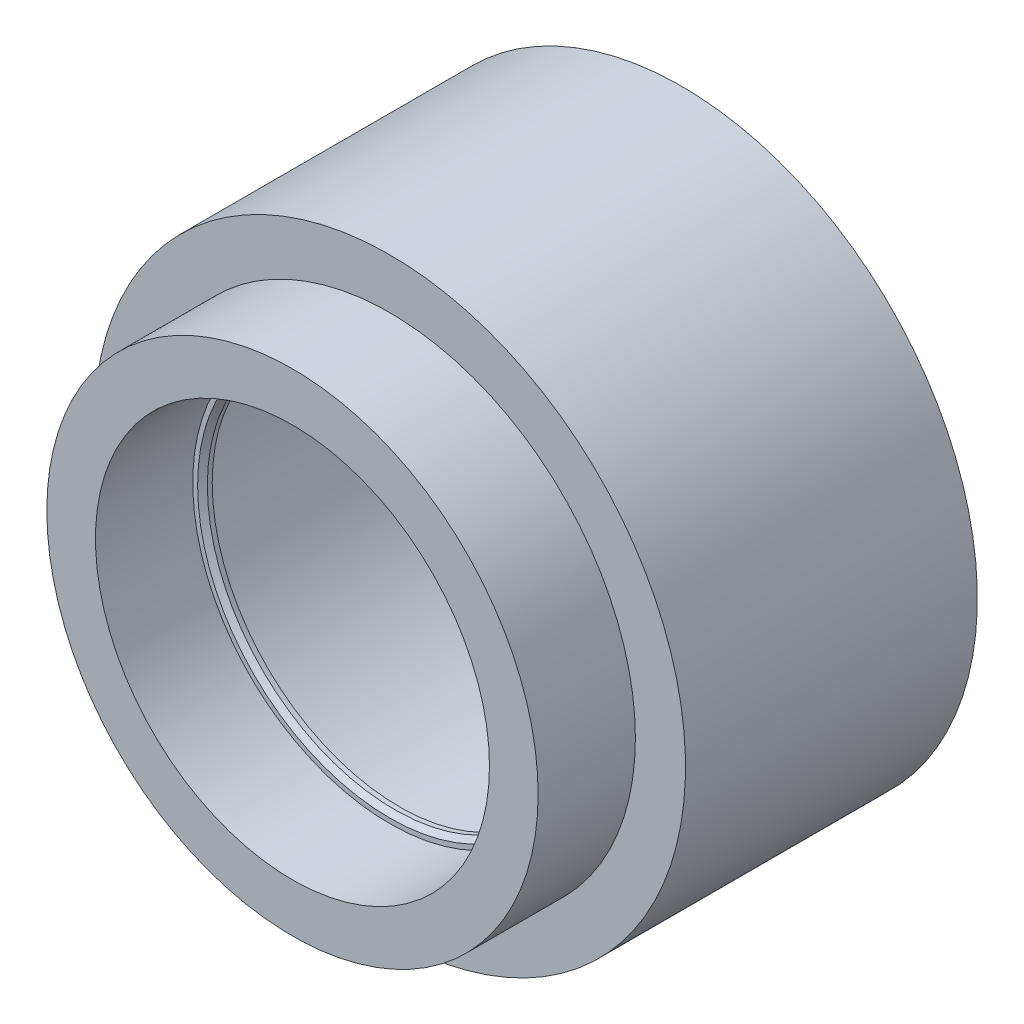
ISO-10303-21;
HEADER;
FILE_DESCRIPTION(('STEP AP214'),'2;1');
FILE_NAME('part.step','',(''),(''),'','','');
FILE_SCHEMA(('AUTOMOTIVE_DESIGN { 1 0 10303 214 1 1 1 1 }'));
ENDSEC;
DATA;
#1=APPLICATION_CONTEXT('core data for automotive mechanical design processes');
#2=APPLICATION_PROTOCOL_DEFINITION('international standard','automotive_design',2000,#1);
#3=PRODUCT_CONTEXT('',#1,'mechanical');
#4=PRODUCT('Part','Part','',(#3));
#5=PRODUCT_RELATED_PRODUCT_CATEGORY('part','',(#4));
#6=PRODUCT_DEFINITION_FORMATION('','',#4);
#7=PRODUCT_DEFINITION_CONTEXT('part definition',#1,'design');
#8=PRODUCT_DEFINITION('design','',#6,#7);
#9=PRODUCT_DEFINITION_SHAPE('','',#8);
#10=(LENGTH_UNIT() NAMED_UNIT(*) SI_UNIT(.MILLI.,.METRE.));
#11=(NAMED_UNIT(*) PLANE_ANGLE_UNIT() SI_UNIT($,.RADIAN.));
#12=(NAMED_UNIT(*) SI_UNIT($,.STERADIAN.) SOLID_ANGLE_UNIT());
#13=UNCERTAINTY_MEASURE_WITH_UNIT(LENGTH_MEASURE(1.E-05),#10,'distance_accuracy_value','');
#14=(GEOMETRIC_REPRESENTATION_CONTEXT(3) GLOBAL_UNCERTAINTY_ASSIGNED_CONTEXT((#13)) GLOBAL_UNIT_ASSIGNED_CONTEXT((#10,
#11,#12)) REPRESENTATION_CONTEXT('',''));
#15=CARTESIAN_POINT('',(0.,0.,0.));
#16=DIRECTION('',(0.,0.,1.));
#17=DIRECTION('',(1.,0.,0.));
#18=AXIS2_PLACEMENT_3D('',#15,#16,#17);
#19=CARTESIAN_POINT('',(0.,0.,-30.));
#20=DIRECTION('',(0.,0.,1.));
#21=DIRECTION('',(1.,0.,0.));
#22=AXIS2_PLACEMENT_3D('',#19,#20,#21);
#23=CYLINDRICAL_SURFACE('',#22,19.25);
#24=CARTESIAN_POINT('',(0.,0.,-0.500000000000004));
#25=DIRECTION('',(0.,0.,-1.));
#26=DIRECTION('',(-1.,0.,0.));
#27=AXIS2_PLACEMENT_3D('',#24,#25,#26);
#28=CIRCLE('',#27,19.25);
#29=CARTESIAN_POINT('',(-19.25,0.,-0.500000000000004));
#30=VERTEX_POINT('',#29);
#31=EDGE_CURVE('E11',#30,#30,#28,.F.);
#32=ORIENTED_EDGE('',*,*,#31,.T.);
#33=EDGE_LOOP('',(#32));
#34=FACE_BOUND('',#33,.T.);
#35=CARTESIAN_POINT('',(0.,0.,-1.));
#36=DIRECTION('',(0.,0.,-1.));
#37=DIRECTION('',(-1.,0.,0.));
#38=AXIS2_PLACEMENT_3D('',#35,#36,#37);
#39=CIRCLE('',#38,19.25);
#40=CARTESIAN_POINT('',(-19.25,0.,-1.));
#41=VERTEX_POINT('',#40);
#42=EDGE_CURVE('E51',#41,#41,#39,.T.);
#43=ORIENTED_EDGE('',*,*,#42,.T.);
#44=EDGE_LOOP('',(#43));
#45=FACE_BOUND('',#44,.T.);
#46=ADVANCED_FACE('F33',(#34,#45),#23,.F.);
#47=CARTESIAN_POINT('',(0.,0.,10.));
#48=DIRECTION('',(0.,0.,1.));
#49=DIRECTION('',(1.,0.,0.));
#50=AXIS2_PLACEMENT_3D('',#47,#48,#49);
#51=PLANE('',#50);
#52=CARTESIAN_POINT('',(0.,0.,10.));
#53=DIRECTION('',(0.,0.,1.));
#54=DIRECTION('',(1.,0.,0.));
#55=AXIS2_PLACEMENT_3D('',#52,#53,#54);
#56=CIRCLE('',#55,25.25);
#57=CARTESIAN_POINT('',(25.25,0.,10.));
#58=VERTEX_POINT('',#57);
#59=EDGE_CURVE('E44',#58,#58,#56,.T.);
#60=ORIENTED_EDGE('',*,*,#59,.T.);
#61=EDGE_LOOP('',(#60));
#62=FACE_BOUND('',#61,.T.);
#63=CARTESIAN_POINT('',(0.,0.,10.));
#64=DIRECTION('',(0.,0.,1.));
#65=DIRECTION('',(1.,0.,0.));
#66=AXIS2_PLACEMENT_3D('',#63,#64,#65);
#67=CIRCLE('',#66,20.25);
#68=CARTESIAN_POINT('',(20.25,0.,10.));
#69=VERTEX_POINT('',#68);
#70=EDGE_CURVE('E48',#69,#69,#67,.T.);
#71=ORIENTED_EDGE('',*,*,#70,.F.);
#72=EDGE_LOOP('',(#71));
#73=FACE_BOUND('',#72,.T.);
#74=ADVANCED_FACE('F100',(#62,#73),#51,.T.);
#75=CARTESIAN_POINT('',(0.,0.,10.));
#76=DIRECTION('',(0.,0.,-1.));
#77=DIRECTION('',(-1.,0.,0.));
#78=AXIS2_PLACEMENT_3D('',#75,#76,#77);
#79=CYLINDRICAL_SURFACE('',#78,25.25);
#80=ORIENTED_EDGE('',*,*,#59,.F.);
#81=EDGE_LOOP('',(#80));
#82=FACE_BOUND('',#81,.T.);
#83=CARTESIAN_POINT('',(0.,0.,0.));
#84=DIRECTION('',(0.,0.,1.));
#85=DIRECTION('',(1.,0.,0.));
#86=AXIS2_PLACEMENT_3D('',#83,#84,#85);
#87=CIRCLE('',#86,25.25);
#88=CARTESIAN_POINT('',(25.25,0.,0.));
#89=VERTEX_POINT('',#88);
#90=EDGE_CURVE('E56',#89,#89,#87,.T.);
#91=ORIENTED_EDGE('',*,*,#90,.T.);
#92=EDGE_LOOP('',(#91));
#93=FACE_BOUND('',#92,.T.);
#94=ADVANCED_FACE('F105',(#82,#93),#79,.T.);
#95=CARTESIAN_POINT('',(0.,0.,10.));
#96=DIRECTION('',(0.,0.,-1.));
#97=DIRECTION('',(-1.,0.,0.));
#98=AXIS2_PLACEMENT_3D('',#95,#96,#97);
#99=CYLINDRICAL_SURFACE('',#98,20.25);
#100=ORIENTED_EDGE('',*,*,#70,.T.);
#101=EDGE_LOOP('',(#100));
#102=FACE_BOUND('',#101,.T.);
#103=CARTESIAN_POINT('',(0.,0.,0.));
#104=DIRECTION('',(0.,0.,1.));
#105=DIRECTION('',(1.,0.,0.));
#106=AXIS2_PLACEMENT_3D('',#103,#104,#105);
#107=CIRCLE('',#106,20.25);
#108=CARTESIAN_POINT('',(20.25,0.,0.));
#109=VERTEX_POINT('',#108);
#110=EDGE_CURVE('E58',#109,#109,#107,.T.);
#111=ORIENTED_EDGE('',*,*,#110,.F.);
#112=EDGE_LOOP('',(#111));
#113=FACE_BOUND('',#112,.T.);
#114=ADVANCED_FACE('F98',(#102,#113),#99,.F.);
#115=CARTESIAN_POINT('',(0.,0.,0.));
#116=DIRECTION('',(0.,0.,-1.));
#117=DIRECTION('',(-1.,0.,0.));
#118=AXIS2_PLACEMENT_3D('',#115,#116,#117);
#119=PLANE('',#118);
#120=CARTESIAN_POINT('',(0.,0.,0.));
#121=DIRECTION('',(0.,0.,-1.));
#122=DIRECTION('',(-1.,0.,0.));
#123=AXIS2_PLACEMENT_3D('',#120,#121,#122);
#124=CIRCLE('',#123,19.75);
#125=CARTESIAN_POINT('',(-19.75,0.,0.));
#126=VERTEX_POINT('',#125);
#127=EDGE_CURVE('E40',#126,#126,#124,.T.);
#128=ORIENTED_EDGE('',*,*,#127,.T.);
#129=EDGE_LOOP('',(#128));
#130=FACE_BOUND('',#129,.T.);
#131=ORIENTED_EDGE('',*,*,#110,.T.);
#132=EDGE_LOOP('',(#131));
#133=FACE_BOUND('',#132,.T.);
#134=ADVANCED_FACE('F81',(#130,#133),#119,.F.);
#135=CARTESIAN_POINT('',(0.,0.,-30.));
#136=DIRECTION('',(0.,0.,-1.));
#137=DIRECTION('',(-1.,0.,0.));
#138=AXIS2_PLACEMENT_3D('',#135,#136,#137);
#139=PLANE('',#138);
#140=CARTESIAN_POINT('',(0.,0.,-30.));
#141=DIRECTION('',(0.,0.,-1.));
#142=DIRECTION('',(-1.,0.,0.));
#143=AXIS2_PLACEMENT_3D('',#140,#141,#142);
#144=CIRCLE('',#143,25.5);
#145=CARTESIAN_POINT('',(-25.5,0.,-30.));
#146=VERTEX_POINT('',#145);
#147=EDGE_CURVE('E71',#146,#146,#144,.T.);
#148=ORIENTED_EDGE('',*,*,#147,.F.);
#149=EDGE_LOOP('',(#148));
#150=FACE_BOUND('',#149,.T.);
#151=CARTESIAN_POINT('',(0.,0.,-30.));
#152=DIRECTION('',(0.,0.,-1.));
#153=DIRECTION('',(-1.,0.,0.));
#154=AXIS2_PLACEMENT_3D('',#151,#152,#153);
#155=CIRCLE('',#154,30.4);
#156=CARTESIAN_POINT('',(-30.4,0.,-30.));
#157=VERTEX_POINT('',#156);
#158=EDGE_CURVE('E59',#157,#157,#155,.T.);
#159=ORIENTED_EDGE('',*,*,#158,.T.);
#160=EDGE_LOOP('',(#159));
#161=FACE_BOUND('',#160,.T.);
#162=ADVANCED_FACE('F77',(#150,#161),#139,.T.);
#163=ORIENTED_EDGE('',*,*,#90,.F.);
#164=EDGE_LOOP('',(#163));
#165=FACE_BOUND('',#164,.T.);
#166=CARTESIAN_POINT('',(0.,0.,0.));
#167=DIRECTION('',(0.,0.,-1.));
#168=DIRECTION('',(-1.,0.,0.));
#169=AXIS2_PLACEMENT_3D('',#166,#167,#168);
#170=CIRCLE('',#169,30.4);
#171=CARTESIAN_POINT('',(-30.4,0.,0.));
#172=VERTEX_POINT('',#171);
#173=EDGE_CURVE('E54',#172,#172,#170,.T.);
#174=ORIENTED_EDGE('',*,*,#173,.F.);
#175=EDGE_LOOP('',(#174));
#176=FACE_BOUND('',#175,.T.);
#177=ADVANCED_FACE('F80',(#165,#176),#119,.F.);
#178=CARTESIAN_POINT('',(0.,0.,-30.));
#179=DIRECTION('',(0.,0.,1.));
#180=DIRECTION('',(1.,0.,0.));
#181=AXIS2_PLACEMENT_3D('',#178,#179,#180);
#182=CYLINDRICAL_SURFACE('',#181,30.4);
#183=ORIENTED_EDGE('',*,*,#158,.F.);
#184=EDGE_LOOP('',(#183));
#185=FACE_BOUND('',#184,.T.);
#186=ORIENTED_EDGE('',*,*,#173,.T.);
#187=EDGE_LOOP('',(#186));
#188=FACE_BOUND('',#187,.T.);
#189=ADVANCED_FACE('F85',(#185,#188),#182,.T.);
#190=CARTESIAN_POINT('',(0.,0.,72.1248916810278));
#191=DIRECTION('',(0.,0.,-1.));
#192=DIRECTION('',(-1.,0.,0.));
#193=AXIS2_PLACEMENT_3D('',#190,#191,#192);
#194=CYLINDRICAL_SURFACE('',#193,25.5);
#195=CARTESIAN_POINT('',(0.,0.,-1.));
#196=DIRECTION('',(0.,0.,-1.));
#197=DIRECTION('',(-1.,0.,0.));
#198=AXIS2_PLACEMENT_3D('',#195,#196,#197);
#199=CIRCLE('',#198,25.5);
#200=CARTESIAN_POINT('',(-25.5,0.,-1.));
#201=VERTEX_POINT('',#200);
#202=EDGE_CURVE('E55',#201,#201,#199,.F.);
#203=ORIENTED_EDGE('',*,*,#202,.T.);
#204=EDGE_LOOP('',(#203));
#205=FACE_BOUND('',#204,.T.);
#206=ORIENTED_EDGE('',*,*,#147,.T.);
#207=EDGE_LOOP('',(#206));
#208=FACE_BOUND('',#207,.T.);
#209=ADVANCED_FACE('F75',(#205,#208),#194,.F.);
#210=CARTESIAN_POINT('',(0.,0.,-1.));
#211=DIRECTION('',(0.,0.,-1.));
#212=DIRECTION('',(-1.,0.,0.));
#213=AXIS2_PLACEMENT_3D('',#210,#211,#212);
#214=PLANE('',#213);
#215=ORIENTED_EDGE('',*,*,#42,.F.);
#216=EDGE_LOOP('',(#215));
#217=FACE_BOUND('',#216,.T.);
#218=ORIENTED_EDGE('',*,*,#202,.F.);
#219=EDGE_LOOP('',(#218));
#220=FACE_BOUND('',#219,.T.);
#221=ADVANCED_FACE('F112',(#217,#220),#214,.T.);
#222=CARTESIAN_POINT('',(0.,0.,0.));
#223=DIRECTION('',(0.,0.,1.));
#224=DIRECTION('',(1.,0.,0.));
#225=AXIS2_PLACEMENT_3D('',#222,#223,#224);
#226=CONICAL_SURFACE('',#225,19.75,0.785398163397434);
#227=ORIENTED_EDGE('',*,*,#31,.F.);
#228=EDGE_LOOP('',(#227));
#229=FACE_BOUND('',#228,.T.);
#230=ORIENTED_EDGE('',*,*,#127,.F.);
#231=EDGE_LOOP('',(#230));
#232=FACE_BOUND('',#231,.T.);
#233=ADVANCED_FACE('F35',(#229,#232),#226,.F.);
#234=CLOSED_SHELL('',(#46,#74,#94,#114,#134,#162,#177,#189,#209,#221,#233));
#235=MANIFOLD_SOLID_BREP('B2',#234);
#236=ADVANCED_BREP_SHAPE_REPRESENTATION('',(#18,#235),#14);
#237=SHAPE_DEFINITION_REPRESENTATION(#9,#236);
ENDSEC;
END-ISO-10303-21;
